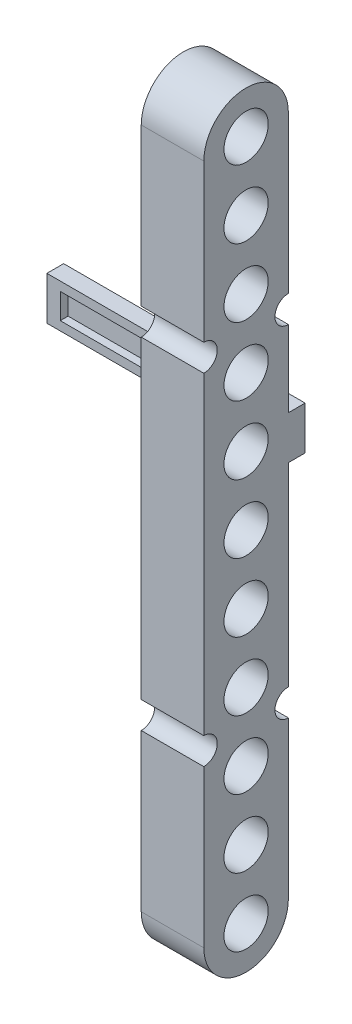
ISO-10303-21;
HEADER;
FILE_DESCRIPTION(('STEP AP214'),'2;1');
FILE_NAME('part.step','',(''),(''),'','','');
FILE_SCHEMA(('AUTOMOTIVE_DESIGN { 1 0 10303 214 1 1 1 1 }'));
ENDSEC;
DATA;
#1=APPLICATION_CONTEXT('core data for automotive mechanical design processes');
#2=APPLICATION_PROTOCOL_DEFINITION('international standard','automotive_design',2000,#1);
#3=PRODUCT_CONTEXT('',#1,'mechanical');
#4=PRODUCT('Part','Part','',(#3));
#5=PRODUCT_RELATED_PRODUCT_CATEGORY('part','',(#4));
#6=PRODUCT_DEFINITION_FORMATION('','',#4);
#7=PRODUCT_DEFINITION_CONTEXT('part definition',#1,'design');
#8=PRODUCT_DEFINITION('design','',#6,#7);
#9=PRODUCT_DEFINITION_SHAPE('','',#8);
#10=(LENGTH_UNIT() NAMED_UNIT(*) SI_UNIT(.MILLI.,.METRE.));
#11=(NAMED_UNIT(*) PLANE_ANGLE_UNIT() SI_UNIT($,.RADIAN.));
#12=(NAMED_UNIT(*) SI_UNIT($,.STERADIAN.) SOLID_ANGLE_UNIT());
#13=UNCERTAINTY_MEASURE_WITH_UNIT(LENGTH_MEASURE(1.E-05),#10,'distance_accuracy_value','');
#14=(GEOMETRIC_REPRESENTATION_CONTEXT(3) GLOBAL_UNCERTAINTY_ASSIGNED_CONTEXT((#13)) GLOBAL_UNIT_ASSIGNED_CONTEXT((#10,
#11,#12)) REPRESENTATION_CONTEXT('',''));
#15=CARTESIAN_POINT('',(0.,0.,0.));
#16=DIRECTION('',(0.,0.,1.));
#17=DIRECTION('',(1.,0.,0.));
#18=AXIS2_PLACEMENT_3D('',#15,#16,#17);
#19=CARTESIAN_POINT('',(0.,0.,-9.45000000000002));
#20=DIRECTION('',(0.,0.,-1.));
#21=DIRECTION('',(0.,1.,0.));
#22=AXIS2_PLACEMENT_3D('',#19,#20,#21);
#23=PLANE('',#22);
#24=DIRECTION('',(0.,1.,0.));
#25=VECTOR('',#24,1.);
#26=CARTESIAN_POINT('',(0.,53.3296441336873,-9.45000000000005));
#27=LINE('',#26,#25);
#28=CARTESIAN_POINT('',(0.,-12.2370411810535,-9.45000000000003));
#29=VERTEX_POINT('',#28);
#30=CARTESIAN_POINT('',(0.,31.1853558663127,-9.45000000000003));
#31=VERTEX_POINT('',#30);
#32=EDGE_CURVE('E395',#29,#31,#27,.T.);
#33=ORIENTED_EDGE('',*,*,#32,.T.);
#34=DIRECTION('',(-1.,0.,0.));
#35=VECTOR('',#34,1.);
#36=CARTESIAN_POINT('',(-38.9999999999999,31.1853558663127,-9.45000000000003));
#37=LINE('',#36,#35);
#38=CARTESIAN_POINT('',(14.,31.1853558663127,-9.45000000000003));
#39=VERTEX_POINT('',#38);
#40=EDGE_CURVE('E203',#39,#31,#37,.T.);
#41=ORIENTED_EDGE('',*,*,#40,.F.);
#42=DIRECTION('',(0.,-1.,0.));
#43=VECTOR('',#42,1.);
#44=CARTESIAN_POINT('',(14.,53.3296441336873,-9.45000000000005));
#45=LINE('',#44,#43);
#46=CARTESIAN_POINT('',(14.,-12.2370411810535,-9.45000000000003));
#47=VERTEX_POINT('',#46);
#48=EDGE_CURVE('E320',#39,#47,#45,.T.);
#49=ORIENTED_EDGE('',*,*,#48,.T.);
#50=DIRECTION('',(-1.,0.,0.));
#51=VECTOR('',#50,1.);
#52=CARTESIAN_POINT('',(186.310080847727,-12.2370411810535,-9.45000000000003));
#53=LINE('',#52,#51);
#54=EDGE_CURVE('E263',#47,#29,#53,.T.);
#55=ORIENTED_EDGE('',*,*,#54,.T.);
#56=EDGE_LOOP('',(#33,#41,#49,#55));
#57=FACE_BOUND('',#56,.T.);
#58=ADVANCED_FACE('F43',(#57),#23,.T.);
#59=CARTESIAN_POINT('',(14.,57.948164724214,-9.45000000000005));
#60=VERTEX_POINT('',#59);
#61=CARTESIAN_POINT('',(14.,40.8553558663126,-9.45000000000004));
#62=VERTEX_POINT('',#61);
#63=EDGE_CURVE('E392',#60,#62,#45,.T.);
#64=ORIENTED_EDGE('',*,*,#63,.T.);
#65=DIRECTION('',(-1.,0.,0.));
#66=VECTOR('',#65,1.);
#67=CARTESIAN_POINT('',(0.,40.8553558663126,-9.45000000000004));
#68=LINE('',#67,#66);
#69=CARTESIAN_POINT('',(0.,40.8553558663126,-9.45000000000004));
#70=VERTEX_POINT('',#69);
#71=EDGE_CURVE('E11',#62,#70,#68,.T.);
#72=ORIENTED_EDGE('',*,*,#71,.T.);
#73=CARTESIAN_POINT('',(0.,57.948164724214,-9.45000000000005));
#74=VERTEX_POINT('',#73);
#75=EDGE_CURVE('E394',#70,#74,#27,.T.);
#76=ORIENTED_EDGE('',*,*,#75,.T.);
#77=DIRECTION('',(-1.,0.,0.));
#78=VECTOR('',#77,1.);
#79=CARTESIAN_POINT('',(186.310080847727,57.948164724214,-9.45000000000005));
#80=LINE('',#79,#78);
#81=EDGE_CURVE('E342',#60,#74,#80,.T.);
#82=ORIENTED_EDGE('',*,*,#81,.F.);
#83=EDGE_LOOP('',(#64,#72,#76,#82));
#84=FACE_BOUND('',#83,.T.);
#85=ADVANCED_FACE('F512',(#84),#23,.T.);
#86=CARTESIAN_POINT('',(14.,53.3296441336873,0.));
#87=DIRECTION('',(-1.,0.,0.));
#88=DIRECTION('',(0.,0.,1.));
#89=AXIS2_PLACEMENT_3D('',#86,#87,#88);
#90=CYLINDRICAL_SURFACE('',#89,4.95000000000002);
#91=CARTESIAN_POINT('',(14.,53.3296441336873,0.));
#92=DIRECTION('',(1.,0.,0.));
#93=DIRECTION('',(0.,0.,-1.));
#94=AXIS2_PLACEMENT_3D('',#91,#92,#93);
#95=CIRCLE('',#94,4.95000000000002);
#96=CARTESIAN_POINT('',(14.,53.3296441336873,-4.95000000000004));
#97=VERTEX_POINT('',#96);
#98=EDGE_CURVE('E413',#97,#97,#95,.T.);
#99=ORIENTED_EDGE('',*,*,#98,.T.);
#100=EDGE_LOOP('',(#99));
#101=FACE_BOUND('',#100,.T.);
#102=CARTESIAN_POINT('',(0.,53.3296441336873,0.));
#103=DIRECTION('',(1.,0.,0.));
#104=DIRECTION('',(0.,0.,-1.));
#105=AXIS2_PLACEMENT_3D('',#102,#103,#104);
#106=CIRCLE('',#105,4.95000000000002);
#107=CARTESIAN_POINT('',(0.,53.3296441336873,-4.95000000000004));
#108=VERTEX_POINT('',#107);
#109=EDGE_CURVE('E404',#108,#108,#106,.T.);
#110=ORIENTED_EDGE('',*,*,#109,.F.);
#111=EDGE_LOOP('',(#110));
#112=FACE_BOUND('',#111,.T.);
#113=ADVANCED_FACE('F530',(#101,#112),#90,.F.);
#114=CARTESIAN_POINT('',(14.,38.0926029526338,0.));
#115=DIRECTION('',(-1.,0.,0.));
#116=DIRECTION('',(0.,0.,1.));
#117=AXIS2_PLACEMENT_3D('',#114,#115,#116);
#118=CYLINDRICAL_SURFACE('',#117,4.95000000000002);
#119=CARTESIAN_POINT('',(14.,38.0926029526338,0.));
#120=DIRECTION('',(1.,0.,0.));
#121=DIRECTION('',(0.,0.,-1.));
#122=AXIS2_PLACEMENT_3D('',#119,#120,#121);
#123=CIRCLE('',#122,4.95000000000002);
#124=CARTESIAN_POINT('',(14.,38.0926029526338,-4.95000000000004));
#125=VERTEX_POINT('',#124);
#126=EDGE_CURVE('E410',#125,#125,#123,.T.);
#127=ORIENTED_EDGE('',*,*,#126,.T.);
#128=EDGE_LOOP('',(#127));
#129=FACE_BOUND('',#128,.T.);
#130=CARTESIAN_POINT('',(0.,38.0926029526338,0.));
#131=DIRECTION('',(1.,0.,0.));
#132=DIRECTION('',(0.,0.,-1.));
#133=AXIS2_PLACEMENT_3D('',#130,#131,#132);
#134=CIRCLE('',#133,4.95000000000002);
#135=CARTESIAN_POINT('',(0.,38.0926029526338,-4.95000000000004));
#136=VERTEX_POINT('',#135);
#137=EDGE_CURVE('E424',#136,#136,#134,.T.);
#138=ORIENTED_EDGE('',*,*,#137,.F.);
#139=EDGE_LOOP('',(#138));
#140=FACE_BOUND('',#139,.T.);
#141=ADVANCED_FACE('F550',(#129,#140),#118,.F.);
#142=CARTESIAN_POINT('',(14.,22.8555617715803,0.));
#143=DIRECTION('',(-1.,0.,0.));
#144=DIRECTION('',(0.,0.,1.));
#145=AXIS2_PLACEMENT_3D('',#142,#143,#144);
#146=CYLINDRICAL_SURFACE('',#145,4.95000000000002);
#147=CARTESIAN_POINT('',(14.,22.8555617715803,0.));
#148=DIRECTION('',(1.,0.,0.));
#149=DIRECTION('',(0.,0.,-1.));
#150=AXIS2_PLACEMENT_3D('',#147,#148,#149);
#151=CIRCLE('',#150,4.95000000000002);
#152=CARTESIAN_POINT('',(14.,22.8555617715803,-4.95000000000003));
#153=VERTEX_POINT('',#152);
#154=EDGE_CURVE('E407',#153,#153,#151,.T.);
#155=ORIENTED_EDGE('',*,*,#154,.T.);
#156=EDGE_LOOP('',(#155));
#157=FACE_BOUND('',#156,.T.);
#158=CARTESIAN_POINT('',(0.,22.8555617715803,0.));
#159=DIRECTION('',(1.,0.,0.));
#160=DIRECTION('',(0.,0.,-1.));
#161=AXIS2_PLACEMENT_3D('',#158,#159,#160);
#162=CIRCLE('',#161,4.95000000000002);
#163=CARTESIAN_POINT('',(0.,22.8555617715803,-4.95000000000003));
#164=VERTEX_POINT('',#163);
#165=EDGE_CURVE('E421',#164,#164,#162,.T.);
#166=ORIENTED_EDGE('',*,*,#165,.F.);
#167=EDGE_LOOP('',(#166));
#168=FACE_BOUND('',#167,.T.);
#169=ADVANCED_FACE('F554',(#157,#168),#146,.F.);
#170=CARTESIAN_POINT('',(14.,-7.61852059052675,0.));
#171=DIRECTION('',(-1.,0.,0.));
#172=DIRECTION('',(0.,0.,1.));
#173=AXIS2_PLACEMENT_3D('',#170,#171,#172);
#174=CYLINDRICAL_SURFACE('',#173,4.95000000000002);
#175=CARTESIAN_POINT('',(14.,-7.61852059052675,0.));
#176=DIRECTION('',(1.,0.,0.));
#177=DIRECTION('',(0.,0.,-1.));
#178=AXIS2_PLACEMENT_3D('',#175,#176,#177);
#179=CIRCLE('',#178,4.95000000000002);
#180=CARTESIAN_POINT('',(14.,-7.61852059052675,-4.95000000000002));
#181=VERTEX_POINT('',#180);
#182=EDGE_CURVE('E403',#181,#181,#179,.T.);
#183=ORIENTED_EDGE('',*,*,#182,.T.);
#184=EDGE_LOOP('',(#183));
#185=FACE_BOUND('',#184,.T.);
#186=CARTESIAN_POINT('',(0.,-7.61852059052675,0.));
#187=DIRECTION('',(1.,0.,0.));
#188=DIRECTION('',(0.,0.,-1.));
#189=AXIS2_PLACEMENT_3D('',#186,#187,#188);
#190=CIRCLE('',#189,4.95000000000002);
#191=CARTESIAN_POINT('',(0.,-7.61852059052675,-4.95000000000002));
#192=VERTEX_POINT('',#191);
#193=EDGE_CURVE('E418',#192,#192,#190,.T.);
#194=ORIENTED_EDGE('',*,*,#193,.F.);
#195=EDGE_LOOP('',(#194));
#196=FACE_BOUND('',#195,.T.);
#197=ADVANCED_FACE('F557',(#185,#196),#174,.F.);
#198=CARTESIAN_POINT('',(14.,7.61852059052675,0.));
#199=DIRECTION('',(-1.,0.,0.));
#200=DIRECTION('',(0.,0.,1.));
#201=AXIS2_PLACEMENT_3D('',#198,#199,#200);
#202=CYLINDRICAL_SURFACE('',#201,4.95000000000002);
#203=CARTESIAN_POINT('',(14.,7.61852059052675,0.));
#204=DIRECTION('',(1.,0.,0.));
#205=DIRECTION('',(0.,0.,-1.));
#206=AXIS2_PLACEMENT_3D('',#203,#204,#205);
#207=CIRCLE('',#206,4.95000000000002);
#208=CARTESIAN_POINT('',(14.,7.61852059052675,-4.95000000000002));
#209=VERTEX_POINT('',#208);
#210=EDGE_CURVE('E400',#209,#209,#207,.T.);
#211=ORIENTED_EDGE('',*,*,#210,.T.);
#212=EDGE_LOOP('',(#211));
#213=FACE_BOUND('',#212,.T.);
#214=CARTESIAN_POINT('',(0.,7.61852059052675,0.));
#215=DIRECTION('',(1.,0.,0.));
#216=DIRECTION('',(0.,0.,-1.));
#217=AXIS2_PLACEMENT_3D('',#214,#215,#216);
#218=CIRCLE('',#217,4.95000000000002);
#219=CARTESIAN_POINT('',(0.,7.61852059052675,-4.95000000000002));
#220=VERTEX_POINT('',#219);
#221=EDGE_CURVE('E398',#220,#220,#218,.T.);
#222=ORIENTED_EDGE('',*,*,#221,.F.);
#223=EDGE_LOOP('',(#222));
#224=FACE_BOUND('',#223,.T.);
#225=ADVANCED_FACE('F45',(#213,#224),#202,.F.);
#226=CARTESIAN_POINT('',(14.,0.,0.));
#227=DIRECTION('',(1.,0.,0.));
#228=DIRECTION('',(0.,0.,-1.));
#229=AXIS2_PLACEMENT_3D('',#226,#227,#228);
#230=PLANE('',#229);
#231=ORIENTED_EDGE('',*,*,#210,.F.);
#232=EDGE_LOOP('',(#231));
#233=FACE_BOUND('',#232,.T.);
#234=ORIENTED_EDGE('',*,*,#182,.F.);
#235=EDGE_LOOP('',(#234));
#236=FACE_BOUND('',#235,.T.);
#237=ORIENTED_EDGE('',*,*,#154,.F.);
#238=EDGE_LOOP('',(#237));
#239=FACE_BOUND('',#238,.T.);
#240=ORIENTED_EDGE('',*,*,#126,.F.);
#241=EDGE_LOOP('',(#240));
#242=FACE_BOUND('',#241,.T.);
#243=ORIENTED_EDGE('',*,*,#98,.F.);
#244=EDGE_LOOP('',(#243));
#245=FACE_BOUND('',#244,.T.);
#246=CARTESIAN_POINT('',(14.,-15.2370411810535,-9.45000000000003));
#247=DIRECTION('',(1.,0.,0.));
#248=DIRECTION('',(0.,0.,-1.));
#249=AXIS2_PLACEMENT_3D('',#246,#247,#248);
#250=CIRCLE('',#249,3.);
#251=CARTESIAN_POINT('',(14.,-18.2370411810535,-9.45000000000003));
#252=VERTEX_POINT('',#251);
#253=EDGE_CURVE('E335',#47,#252,#250,.T.);
#254=ORIENTED_EDGE('',*,*,#253,.F.);
#255=ORIENTED_EDGE('',*,*,#48,.F.);
#256=DIRECTION('',(0.,0.,1.));
#257=VECTOR('',#256,1.);
#258=CARTESIAN_POINT('',(14.,31.1853558663127,-66.0589910588951));
#259=LINE('',#258,#257);
#260=CARTESIAN_POINT('',(14.,31.1853558663127,-13.1999999999994));
#261=VERTEX_POINT('',#260);
#262=EDGE_CURVE('E202',#261,#39,#259,.T.);
#263=ORIENTED_EDGE('',*,*,#262,.F.);
#264=DIRECTION('',(0.,-1.,0.));
#265=VECTOR('',#264,1.);
#266=CARTESIAN_POINT('',(14.,31.1853558663127,-13.1999999999994));
#267=LINE('',#266,#265);
#268=CARTESIAN_POINT('',(14.,40.8553558663126,-13.1999999999995));
#269=VERTEX_POINT('',#268);
#270=EDGE_CURVE('E216',#269,#261,#267,.T.);
#271=ORIENTED_EDGE('',*,*,#270,.F.);
#272=DIRECTION('',(0.,0.,1.));
#273=VECTOR('',#272,1.);
#274=CARTESIAN_POINT('',(14.,40.8553558663126,-66.0589910588951));
#275=LINE('',#274,#273);
#276=EDGE_CURVE('E256',#269,#62,#275,.T.);
#277=ORIENTED_EDGE('',*,*,#276,.T.);
#278=ORIENTED_EDGE('',*,*,#63,.F.);
#279=CARTESIAN_POINT('',(14.,60.948164724214,-9.45000000000005));
#280=DIRECTION('',(1.,0.,0.));
#281=DIRECTION('',(0.,0.,-1.));
#282=AXIS2_PLACEMENT_3D('',#279,#280,#281);
#283=CIRCLE('',#282,3.);
#284=CARTESIAN_POINT('',(14.,63.948164724214,-9.45000000000005));
#285=VERTEX_POINT('',#284);
#286=EDGE_CURVE('E339',#285,#60,#283,.T.);
#287=ORIENTED_EDGE('',*,*,#286,.F.);
#288=DIRECTION('',(0.,-1.,0.));
#289=VECTOR('',#288,1.);
#290=CARTESIAN_POINT('',(14.,63.948164724214,-9.45000000000005));
#291=LINE('',#290,#289);
#292=CARTESIAN_POINT('',(14.,99.0407676768478,-9.45000000000009));
#293=VERTEX_POINT('',#292);
#294=EDGE_CURVE('E343',#293,#285,#291,.T.);
#295=ORIENTED_EDGE('',*,*,#294,.F.);
#296=CARTESIAN_POINT('',(14.,99.0407676768478,0.));
#297=DIRECTION('',(1.,0.,0.));
#298=DIRECTION('',(0.,0.,-1.));
#299=AXIS2_PLACEMENT_3D('',#296,#297,#298);
#300=CIRCLE('',#299,9.45000000000004);
#301=CARTESIAN_POINT('',(14.,99.0407676768478,9.45000000000004));
#302=VERTEX_POINT('',#301);
#303=EDGE_CURVE('E347',#302,#293,#300,.F.);
#304=ORIENTED_EDGE('',*,*,#303,.F.);
#305=DIRECTION('',(0.,1.,0.));
#306=VECTOR('',#305,1.);
#307=CARTESIAN_POINT('',(14.,63.948164724214,9.45000000000004));
#308=LINE('',#307,#306);
#309=CARTESIAN_POINT('',(14.,63.948164724214,9.45000000000004));
#310=VERTEX_POINT('',#309);
#311=EDGE_CURVE('E351',#310,#302,#308,.T.);
#312=ORIENTED_EDGE('',*,*,#311,.F.);
#313=CARTESIAN_POINT('',(14.,60.948164724214,9.44999999999999));
#314=DIRECTION('',(1.,0.,0.));
#315=DIRECTION('',(0.,0.,-1.));
#316=AXIS2_PLACEMENT_3D('',#313,#314,#315);
#317=CIRCLE('',#316,3.);
#318=CARTESIAN_POINT('',(14.,57.948164724214,9.45000000000004));
#319=VERTEX_POINT('',#318);
#320=EDGE_CURVE('E355',#319,#310,#317,.T.);
#321=ORIENTED_EDGE('',*,*,#320,.F.);
#322=DIRECTION('',(0.,1.,0.));
#323=VECTOR('',#322,1.);
#324=CARTESIAN_POINT('',(14.,-12.2370411810535,9.45000000000004));
#325=LINE('',#324,#323);
#326=CARTESIAN_POINT('',(14.,-12.2370411810535,9.45000000000004));
#327=VERTEX_POINT('',#326);
#328=EDGE_CURVE('E359',#327,#319,#325,.T.);
#329=ORIENTED_EDGE('',*,*,#328,.F.);
#330=CARTESIAN_POINT('',(14.,-15.2370411810535,9.45000000000003));
#331=DIRECTION('',(1.,0.,0.));
#332=DIRECTION('',(0.,0.,-1.));
#333=AXIS2_PLACEMENT_3D('',#330,#331,#332);
#334=CIRCLE('',#333,3.);
#335=CARTESIAN_POINT('',(14.,-18.2370411810535,9.45000000000004));
#336=VERTEX_POINT('',#335);
#337=EDGE_CURVE('E363',#336,#327,#334,.T.);
#338=ORIENTED_EDGE('',*,*,#337,.F.);
#339=DIRECTION('',(0.,1.,0.));
#340=VECTOR('',#339,1.);
#341=CARTESIAN_POINT('',(14.,-53.3296441336873,9.45000000000004));
#342=LINE('',#341,#340);
#343=CARTESIAN_POINT('',(14.,-53.3296441336873,9.45000000000005));
#344=VERTEX_POINT('',#343);
#345=EDGE_CURVE('E367',#344,#336,#342,.T.);
#346=ORIENTED_EDGE('',*,*,#345,.F.);
#347=CARTESIAN_POINT('',(14.,-53.3296441336873,0.));
#348=DIRECTION('',(1.,0.,0.));
#349=DIRECTION('',(0.,0.,-1.));
#350=AXIS2_PLACEMENT_3D('',#347,#348,#349);
#351=CIRCLE('',#350,9.45000000000003);
#352=CARTESIAN_POINT('',(14.,-53.3296441336873,-9.45000000000002));
#353=VERTEX_POINT('',#352);
#354=EDGE_CURVE('E371',#353,#344,#351,.F.);
#355=ORIENTED_EDGE('',*,*,#354,.F.);
#356=DIRECTION('',(0.,-1.,0.));
#357=VECTOR('',#356,1.);
#358=CARTESIAN_POINT('',(14.,-18.2370411810535,-9.45000000000003));
#359=LINE('',#358,#357);
#360=EDGE_CURVE('E375',#252,#353,#359,.T.);
#361=ORIENTED_EDGE('',*,*,#360,.F.);
#362=EDGE_LOOP('',(#254,#255,#263,#271,#277,#278,#287,#295,#304,#312,#321,#329,#338,#346,#355,#361));
#363=FACE_BOUND('',#362,.T.);
#364=CARTESIAN_POINT('',(14.,99.0407676768478,0.));
#365=DIRECTION('',(1.,0.,0.));
#366=DIRECTION('',(0.,0.,-1.));
#367=AXIS2_PLACEMENT_3D('',#364,#365,#366);
#368=CIRCLE('',#367,4.95000000000002);
#369=CARTESIAN_POINT('',(14.,99.0407676768478,-4.95000000000007));
#370=VERTEX_POINT('',#369);
#371=EDGE_CURVE('E317',#370,#370,#368,.F.);
#372=ORIENTED_EDGE('',*,*,#371,.T.);
#373=EDGE_LOOP('',(#372));
#374=FACE_BOUND('',#373,.T.);
#375=CARTESIAN_POINT('',(14.,68.5666853147407,0.));
#376=DIRECTION('',(1.,0.,0.));
#377=DIRECTION('',(0.,0.,-1.));
#378=AXIS2_PLACEMENT_3D('',#375,#376,#377);
#379=CIRCLE('',#378,4.95000000000002);
#380=CARTESIAN_POINT('',(14.,68.5666853147407,-4.95000000000005));
#381=VERTEX_POINT('',#380);
#382=EDGE_CURVE('E321',#381,#381,#379,.F.);
#383=ORIENTED_EDGE('',*,*,#382,.T.);
#384=EDGE_LOOP('',(#383));
#385=FACE_BOUND('',#384,.T.);
#386=CARTESIAN_POINT('',(14.,-53.3296441336873,0.));
#387=DIRECTION('',(1.,0.,0.));
#388=DIRECTION('',(0.,0.,-1.));
#389=AXIS2_PLACEMENT_3D('',#386,#387,#388);
#390=CIRCLE('',#389,4.95000000000002);
#391=CARTESIAN_POINT('',(14.,-53.3296441336873,-4.95000000000001));
#392=VERTEX_POINT('',#391);
#393=EDGE_CURVE('E324',#392,#392,#390,.F.);
#394=ORIENTED_EDGE('',*,*,#393,.T.);
#395=EDGE_LOOP('',(#394));
#396=FACE_BOUND('',#395,.T.);
#397=CARTESIAN_POINT('',(14.,-22.8555617715803,0.));
#398=DIRECTION('',(1.,0.,0.));
#399=DIRECTION('',(0.,0.,-1.));
#400=AXIS2_PLACEMENT_3D('',#397,#398,#399);
#401=CIRCLE('',#400,4.95000000000002);
#402=CARTESIAN_POINT('',(14.,-22.8555617715803,-4.95000000000002));
#403=VERTEX_POINT('',#402);
#404=EDGE_CURVE('E327',#403,#403,#401,.F.);
#405=ORIENTED_EDGE('',*,*,#404,.T.);
#406=EDGE_LOOP('',(#405));
#407=FACE_BOUND('',#406,.T.);
#408=CARTESIAN_POINT('',(14.,-38.0926029526338,0.));
#409=DIRECTION('',(1.,0.,0.));
#410=DIRECTION('',(0.,0.,-1.));
#411=AXIS2_PLACEMENT_3D('',#408,#409,#410);
#412=CIRCLE('',#411,4.95000000000002);
#413=CARTESIAN_POINT('',(14.,-38.0926029526338,-4.95000000000001));
#414=VERTEX_POINT('',#413);
#415=EDGE_CURVE('E330',#414,#414,#412,.F.);
#416=ORIENTED_EDGE('',*,*,#415,.T.);
#417=EDGE_LOOP('',(#416));
#418=FACE_BOUND('',#417,.T.);
#419=CARTESIAN_POINT('',(14.,83.8037264957942,0.));
#420=DIRECTION('',(1.,0.,0.));
#421=DIRECTION('',(0.,0.,-1.));
#422=AXIS2_PLACEMENT_3D('',#419,#420,#421);
#423=CIRCLE('',#422,4.95000000000002);
#424=CARTESIAN_POINT('',(14.,83.8037264957942,-4.95000000000006));
#425=VERTEX_POINT('',#424);
#426=EDGE_CURVE('E267',#425,#425,#423,.F.);
#427=ORIENTED_EDGE('',*,*,#426,.T.);
#428=EDGE_LOOP('',(#427));
#429=FACE_BOUND('',#428,.T.);
#430=ADVANCED_FACE('F464',(#233,#236,#239,#242,#245,#363,#374,#385,#396,#407,#418,#429),#230,.T.);
#431=CARTESIAN_POINT('',(0.,0.,0.));
#432=DIRECTION('',(1.,0.,0.));
#433=DIRECTION('',(0.,0.,-1.));
#434=AXIS2_PLACEMENT_3D('',#431,#432,#433);
#435=PLANE('',#434);
#436=ORIENTED_EDGE('',*,*,#221,.T.);
#437=EDGE_LOOP('',(#436));
#438=FACE_BOUND('',#437,.T.);
#439=ORIENTED_EDGE('',*,*,#193,.T.);
#440=EDGE_LOOP('',(#439));
#441=FACE_BOUND('',#440,.T.);
#442=ORIENTED_EDGE('',*,*,#165,.T.);
#443=EDGE_LOOP('',(#442));
#444=FACE_BOUND('',#443,.T.);
#445=ORIENTED_EDGE('',*,*,#137,.T.);
#446=EDGE_LOOP('',(#445));
#447=FACE_BOUND('',#446,.T.);
#448=ORIENTED_EDGE('',*,*,#109,.T.);
#449=EDGE_LOOP('',(#448));
#450=FACE_BOUND('',#449,.T.);
#451=ORIENTED_EDGE('',*,*,#32,.F.);
#452=CARTESIAN_POINT('',(0.,-15.2370411810535,-9.45000000000003));
#453=DIRECTION('',(1.,0.,0.));
#454=DIRECTION('',(0.,0.,1.));
#455=AXIS2_PLACEMENT_3D('',#452,#453,#454);
#456=CIRCLE('',#455,3.);
#457=CARTESIAN_POINT('',(0.,-18.2370411810535,-9.45000000000003));
#458=VERTEX_POINT('',#457);
#459=EDGE_CURVE('E295',#29,#458,#456,.T.);
#460=ORIENTED_EDGE('',*,*,#459,.T.);
#461=DIRECTION('',(0.,-1.,0.));
#462=VECTOR('',#461,1.);
#463=CARTESIAN_POINT('',(0.,-18.2370411810535,-9.45000000000003));
#464=LINE('',#463,#462);
#465=CARTESIAN_POINT('',(0.,-53.3296441336873,-9.45000000000002));
#466=VERTEX_POINT('',#465);
#467=EDGE_CURVE('E292',#458,#466,#464,.T.);
#468=ORIENTED_EDGE('',*,*,#467,.T.);
#469=CARTESIAN_POINT('',(0.,-53.3296441336873,0.));
#470=DIRECTION('',(-1.,0.,0.));
#471=DIRECTION('',(0.,0.,1.));
#472=AXIS2_PLACEMENT_3D('',#469,#470,#471);
#473=CIRCLE('',#472,9.45000000000003);
#474=CARTESIAN_POINT('',(0.,-53.3296441336873,9.45000000000004));
#475=VERTEX_POINT('',#474);
#476=EDGE_CURVE('E289',#466,#475,#473,.T.);
#477=ORIENTED_EDGE('',*,*,#476,.T.);
#478=DIRECTION('',(0.,1.,0.));
#479=VECTOR('',#478,1.);
#480=CARTESIAN_POINT('',(0.,-53.3296441336873,9.45000000000004));
#481=LINE('',#480,#479);
#482=CARTESIAN_POINT('',(0.,-18.2370411810535,9.45000000000004));
#483=VERTEX_POINT('',#482);
#484=EDGE_CURVE('E286',#475,#483,#481,.T.);
#485=ORIENTED_EDGE('',*,*,#484,.T.);
#486=CARTESIAN_POINT('',(0.,-15.2370411810535,9.45000000000003));
#487=DIRECTION('',(1.,0.,0.));
#488=DIRECTION('',(0.,0.,1.));
#489=AXIS2_PLACEMENT_3D('',#486,#487,#488);
#490=CIRCLE('',#489,3.);
#491=CARTESIAN_POINT('',(0.,-12.2370411810535,9.45000000000004));
#492=VERTEX_POINT('',#491);
#493=EDGE_CURVE('E283',#483,#492,#490,.T.);
#494=ORIENTED_EDGE('',*,*,#493,.T.);
#495=DIRECTION('',(0.,1.,0.));
#496=VECTOR('',#495,1.);
#497=CARTESIAN_POINT('',(0.,-12.2370411810535,9.45000000000004));
#498=LINE('',#497,#496);
#499=CARTESIAN_POINT('',(0.,57.948164724214,9.45000000000004));
#500=VERTEX_POINT('',#499);
#501=EDGE_CURVE('E280',#492,#500,#498,.T.);
#502=ORIENTED_EDGE('',*,*,#501,.T.);
#503=CARTESIAN_POINT('',(0.,60.948164724214,9.44999999999999));
#504=DIRECTION('',(1.,0.,0.));
#505=DIRECTION('',(0.,0.,1.));
#506=AXIS2_PLACEMENT_3D('',#503,#504,#505);
#507=CIRCLE('',#506,3.);
#508=CARTESIAN_POINT('',(0.,63.948164724214,9.45000000000004));
#509=VERTEX_POINT('',#508);
#510=EDGE_CURVE('E277',#500,#509,#507,.T.);
#511=ORIENTED_EDGE('',*,*,#510,.T.);
#512=DIRECTION('',(0.,1.,0.));
#513=VECTOR('',#512,1.);
#514=CARTESIAN_POINT('',(0.,63.948164724214,9.45000000000004));
#515=LINE('',#514,#513);
#516=CARTESIAN_POINT('',(0.,99.0407676768478,9.45));
#517=VERTEX_POINT('',#516);
#518=EDGE_CURVE('E274',#509,#517,#515,.T.);
#519=ORIENTED_EDGE('',*,*,#518,.T.);
#520=CARTESIAN_POINT('',(0.,99.0407676768478,0.));
#521=DIRECTION('',(-1.,0.,0.));
#522=DIRECTION('',(0.,0.,1.));
#523=AXIS2_PLACEMENT_3D('',#520,#521,#522);
#524=CIRCLE('',#523,9.45000000000004);
#525=CARTESIAN_POINT('',(0.,99.0407676768478,-9.45000000000005));
#526=VERTEX_POINT('',#525);
#527=EDGE_CURVE('E271',#517,#526,#524,.T.);
#528=ORIENTED_EDGE('',*,*,#527,.T.);
#529=DIRECTION('',(0.,-1.,0.));
#530=VECTOR('',#529,1.);
#531=CARTESIAN_POINT('',(0.,63.948164724214,-9.45000000000005));
#532=LINE('',#531,#530);
#533=CARTESIAN_POINT('',(0.,63.948164724214,-9.45000000000005));
#534=VERTEX_POINT('',#533);
#535=EDGE_CURVE('E268',#526,#534,#532,.T.);
#536=ORIENTED_EDGE('',*,*,#535,.T.);
#537=CARTESIAN_POINT('',(0.,60.948164724214,-9.45000000000005));
#538=DIRECTION('',(1.,0.,0.));
#539=DIRECTION('',(0.,0.,1.));
#540=AXIS2_PLACEMENT_3D('',#537,#538,#539);
#541=CIRCLE('',#540,3.);
#542=EDGE_CURVE('E264',#534,#74,#541,.T.);
#543=ORIENTED_EDGE('',*,*,#542,.T.);
#544=ORIENTED_EDGE('',*,*,#75,.F.);
#545=CARTESIAN_POINT('',(0.,38.8553558663126,-9.45000000000004));
#546=VERTEX_POINT('',#545);
#547=EDGE_CURVE('E438',#546,#70,#27,.T.);
#548=ORIENTED_EDGE('',*,*,#547,.F.);
#549=CARTESIAN_POINT('',(0.,33.1853558663127,-9.45000000000004));
#550=VERTEX_POINT('',#549);
#551=EDGE_CURVE('E455',#550,#546,#27,.T.);
#552=ORIENTED_EDGE('',*,*,#551,.F.);
#553=EDGE_CURVE('E399',#31,#550,#27,.T.);
#554=ORIENTED_EDGE('',*,*,#553,.F.);
#555=EDGE_LOOP('',(#451,#460,#468,#477,#485,#494,#502,#511,#519,#528,#536,#543,#544,#548,#552,#554));
#556=FACE_BOUND('',#555,.T.);
#557=CARTESIAN_POINT('',(0.,99.0407676768478,0.));
#558=DIRECTION('',(-1.,0.,0.));
#559=DIRECTION('',(0.,0.,1.));
#560=AXIS2_PLACEMENT_3D('',#557,#558,#559);
#561=CIRCLE('',#560,4.95000000000002);
#562=CARTESIAN_POINT('',(0.,99.0407676768478,4.94999999999998));
#563=VERTEX_POINT('',#562);
#564=EDGE_CURVE('E299',#563,#563,#561,.T.);
#565=ORIENTED_EDGE('',*,*,#564,.F.);
#566=EDGE_LOOP('',(#565));
#567=FACE_BOUND('',#566,.T.);
#568=CARTESIAN_POINT('',(0.,83.8037264957942,0.));
#569=DIRECTION('',(-1.,0.,0.));
#570=DIRECTION('',(0.,0.,1.));
#571=AXIS2_PLACEMENT_3D('',#568,#569,#570);
#572=CIRCLE('',#571,4.95000000000002);
#573=CARTESIAN_POINT('',(0.,83.8037264957942,4.94999999999999));
#574=VERTEX_POINT('',#573);
#575=EDGE_CURVE('E302',#574,#574,#572,.T.);
#576=ORIENTED_EDGE('',*,*,#575,.F.);
#577=EDGE_LOOP('',(#576));
#578=FACE_BOUND('',#577,.T.);
#579=CARTESIAN_POINT('',(0.,68.5666853147407,0.));
#580=DIRECTION('',(-1.,0.,0.));
#581=DIRECTION('',(0.,0.,1.));
#582=AXIS2_PLACEMENT_3D('',#579,#580,#581);
#583=CIRCLE('',#582,4.95000000000002);
#584=CARTESIAN_POINT('',(0.,68.5666853147407,4.94999999999999));
#585=VERTEX_POINT('',#584);
#586=EDGE_CURVE('E306',#585,#585,#583,.T.);
#587=ORIENTED_EDGE('',*,*,#586,.F.);
#588=EDGE_LOOP('',(#587));
#589=FACE_BOUND('',#588,.T.);
#590=CARTESIAN_POINT('',(0.,-53.3296441336873,0.));
#591=DIRECTION('',(-1.,0.,0.));
#592=DIRECTION('',(0.,0.,1.));
#593=AXIS2_PLACEMENT_3D('',#590,#591,#592);
#594=CIRCLE('',#593,4.95000000000002);
#595=CARTESIAN_POINT('',(0.,-53.3296441336873,4.95000000000004));
#596=VERTEX_POINT('',#595);
#597=EDGE_CURVE('E309',#596,#596,#594,.T.);
#598=ORIENTED_EDGE('',*,*,#597,.F.);
#599=EDGE_LOOP('',(#598));
#600=FACE_BOUND('',#599,.T.);
#601=CARTESIAN_POINT('',(0.,-38.0926029526338,0.));
#602=DIRECTION('',(-1.,0.,0.));
#603=DIRECTION('',(0.,0.,1.));
#604=AXIS2_PLACEMENT_3D('',#601,#602,#603);
#605=CIRCLE('',#604,4.95000000000002);
#606=CARTESIAN_POINT('',(0.,-38.0926029526338,4.95000000000003));
#607=VERTEX_POINT('',#606);
#608=EDGE_CURVE('E312',#607,#607,#605,.T.);
#609=ORIENTED_EDGE('',*,*,#608,.F.);
#610=EDGE_LOOP('',(#609));
#611=FACE_BOUND('',#610,.T.);
#612=CARTESIAN_POINT('',(0.,-22.8555617715803,0.));
#613=DIRECTION('',(-1.,0.,0.));
#614=DIRECTION('',(0.,0.,1.));
#615=AXIS2_PLACEMENT_3D('',#612,#613,#614);
#616=CIRCLE('',#615,4.95000000000002);
#617=CARTESIAN_POINT('',(0.,-22.8555617715803,4.95000000000002));
#618=VERTEX_POINT('',#617);
#619=EDGE_CURVE('E298',#618,#618,#616,.T.);
#620=ORIENTED_EDGE('',*,*,#619,.F.);
#621=EDGE_LOOP('',(#620));
#622=FACE_BOUND('',#621,.T.);
#623=ADVANCED_FACE('F457',(#438,#441,#444,#447,#450,#556,#567,#578,#589,#600,#611,#622),#435,.F.);
#624=DIRECTION('',(-1.,0.,0.));
#625=VECTOR('',#624,1.);
#626=CARTESIAN_POINT('',(-36.9999999999999,33.1853558663127,-9.45000000000004));
#627=LINE('',#626,#625);
#628=CARTESIAN_POINT('',(12.,33.1853558663127,-9.45000000000004));
#629=VERTEX_POINT('',#628);
#630=EDGE_CURVE('E238',#629,#550,#627,.T.);
#631=ORIENTED_EDGE('',*,*,#630,.T.);
#632=ORIENTED_EDGE('',*,*,#551,.T.);
#633=DIRECTION('',(-1.,0.,0.));
#634=VECTOR('',#633,1.);
#635=CARTESIAN_POINT('',(0.,38.8553558663126,-9.45000000000004));
#636=LINE('',#635,#634);
#637=CARTESIAN_POINT('',(12.,38.8553558663126,-9.45000000000004));
#638=VERTEX_POINT('',#637);
#639=EDGE_CURVE('E51',#638,#546,#636,.T.);
#640=ORIENTED_EDGE('',*,*,#639,.F.);
#641=DIRECTION('',(0.,-1.,0.));
#642=VECTOR('',#641,1.);
#643=CARTESIAN_POINT('',(12.,33.1853558663127,-9.45000000000004));
#644=LINE('',#643,#642);
#645=EDGE_CURVE('E58',#638,#629,#644,.T.);
#646=ORIENTED_EDGE('',*,*,#645,.T.);
#647=EDGE_LOOP('',(#631,#632,#640,#646));
#648=FACE_BOUND('',#647,.T.);
#649=ADVANCED_FACE('F454',(#648),#23,.T.);
#650=CARTESIAN_POINT('',(186.310080847727,60.948164724214,-9.45000000000005));
#651=DIRECTION('',(-1.,0.,0.));
#652=DIRECTION('',(0.,0.,1.));
#653=AXIS2_PLACEMENT_3D('',#650,#651,#652);
#654=CYLINDRICAL_SURFACE('',#653,3.);
#655=DIRECTION('',(-1.,0.,0.));
#656=VECTOR('',#655,1.);
#657=CARTESIAN_POINT('',(186.310080847727,63.948164724214,-9.45000000000005));
#658=LINE('',#657,#656);
#659=EDGE_CURVE('E346',#285,#534,#658,.T.);
#660=ORIENTED_EDGE('',*,*,#659,.F.);
#661=ORIENTED_EDGE('',*,*,#286,.T.);
#662=ORIENTED_EDGE('',*,*,#81,.T.);
#663=ORIENTED_EDGE('',*,*,#542,.F.);
#664=EDGE_LOOP('',(#660,#661,#662,#663));
#665=FACE_BOUND('',#664,.T.);
#666=ADVANCED_FACE('F509',(#665),#654,.F.);
#667=CARTESIAN_POINT('',(186.310080847727,63.948164724214,-9.45000000000005));
#668=DIRECTION('',(0.,0.,-1.));
#669=DIRECTION('',(-1.,0.,0.));
#670=AXIS2_PLACEMENT_3D('',#667,#668,#669);
#671=PLANE('',#670);
#672=DIRECTION('',(-1.,0.,0.));
#673=VECTOR('',#672,1.);
#674=CARTESIAN_POINT('',(186.310080847727,99.0407676768478,-9.45000000000005));
#675=LINE('',#674,#673);
#676=EDGE_CURVE('E350',#293,#526,#675,.T.);
#677=ORIENTED_EDGE('',*,*,#676,.F.);
#678=ORIENTED_EDGE('',*,*,#294,.T.);
#679=ORIENTED_EDGE('',*,*,#659,.T.);
#680=ORIENTED_EDGE('',*,*,#535,.F.);
#681=EDGE_LOOP('',(#677,#678,#679,#680));
#682=FACE_BOUND('',#681,.T.);
#683=ADVANCED_FACE('F505',(#682),#671,.T.);
#684=CARTESIAN_POINT('',(186.310080847727,99.0407676768478,0.));
#685=DIRECTION('',(-1.,0.,0.));
#686=DIRECTION('',(0.,0.,1.));
#687=AXIS2_PLACEMENT_3D('',#684,#685,#686);
#688=CYLINDRICAL_SURFACE('',#687,9.45000000000004);
#689=DIRECTION('',(-1.,0.,0.));
#690=VECTOR('',#689,1.);
#691=CARTESIAN_POINT('',(186.310080847727,99.0407676768478,9.45));
#692=LINE('',#691,#690);
#693=EDGE_CURVE('E354',#302,#517,#692,.T.);
#694=ORIENTED_EDGE('',*,*,#693,.F.);
#695=ORIENTED_EDGE('',*,*,#303,.T.);
#696=ORIENTED_EDGE('',*,*,#676,.T.);
#697=ORIENTED_EDGE('',*,*,#527,.F.);
#698=EDGE_LOOP('',(#694,#695,#696,#697));
#699=FACE_BOUND('',#698,.T.);
#700=ADVANCED_FACE('F501',(#699),#688,.T.);
#701=CARTESIAN_POINT('',(186.310080847727,63.948164724214,9.45000000000004));
#702=DIRECTION('',(0.,0.,1.));
#703=DIRECTION('',(0.,-1.,0.));
#704=AXIS2_PLACEMENT_3D('',#701,#702,#703);
#705=PLANE('',#704);
#706=DIRECTION('',(-1.,0.,0.));
#707=VECTOR('',#706,1.);
#708=CARTESIAN_POINT('',(186.310080847727,63.948164724214,9.45000000000004));
#709=LINE('',#708,#707);
#710=EDGE_CURVE('E358',#310,#509,#709,.T.);
#711=ORIENTED_EDGE('',*,*,#710,.F.);
#712=ORIENTED_EDGE('',*,*,#311,.T.);
#713=ORIENTED_EDGE('',*,*,#693,.T.);
#714=ORIENTED_EDGE('',*,*,#518,.F.);
#715=EDGE_LOOP('',(#711,#712,#713,#714));
#716=FACE_BOUND('',#715,.T.);
#717=ADVANCED_FACE('F498',(#716),#705,.T.);
#718=CARTESIAN_POINT('',(186.310080847727,60.948164724214,9.44999999999999));
#719=DIRECTION('',(-1.,0.,0.));
#720=DIRECTION('',(0.,0.,1.));
#721=AXIS2_PLACEMENT_3D('',#718,#719,#720);
#722=CYLINDRICAL_SURFACE('',#721,3.);
#723=DIRECTION('',(-1.,0.,0.));
#724=VECTOR('',#723,1.);
#725=CARTESIAN_POINT('',(186.310080847727,57.948164724214,9.45000000000004));
#726=LINE('',#725,#724);
#727=EDGE_CURVE('E362',#319,#500,#726,.T.);
#728=ORIENTED_EDGE('',*,*,#727,.F.);
#729=ORIENTED_EDGE('',*,*,#320,.T.);
#730=ORIENTED_EDGE('',*,*,#710,.T.);
#731=ORIENTED_EDGE('',*,*,#510,.F.);
#732=EDGE_LOOP('',(#728,#729,#730,#731));
#733=FACE_BOUND('',#732,.T.);
#734=ADVANCED_FACE('F493',(#733),#722,.F.);
#735=CARTESIAN_POINT('',(186.310080847727,-12.2370411810535,9.45000000000004));
#736=DIRECTION('',(0.,0.,1.));
#737=DIRECTION('',(0.,-1.,0.));
#738=AXIS2_PLACEMENT_3D('',#735,#736,#737);
#739=PLANE('',#738);
#740=DIRECTION('',(-1.,0.,0.));
#741=VECTOR('',#740,1.);
#742=CARTESIAN_POINT('',(186.310080847727,-12.2370411810535,9.45000000000004));
#743=LINE('',#742,#741);
#744=EDGE_CURVE('E366',#327,#492,#743,.T.);
#745=ORIENTED_EDGE('',*,*,#744,.F.);
#746=ORIENTED_EDGE('',*,*,#328,.T.);
#747=ORIENTED_EDGE('',*,*,#727,.T.);
#748=ORIENTED_EDGE('',*,*,#501,.F.);
#749=EDGE_LOOP('',(#745,#746,#747,#748));
#750=FACE_BOUND('',#749,.T.);
#751=ADVANCED_FACE('F489',(#750),#739,.T.);
#752=CARTESIAN_POINT('',(186.310080847727,-15.2370411810535,9.45000000000003));
#753=DIRECTION('',(-1.,0.,0.));
#754=DIRECTION('',(0.,0.,1.));
#755=AXIS2_PLACEMENT_3D('',#752,#753,#754);
#756=CYLINDRICAL_SURFACE('',#755,3.);
#757=DIRECTION('',(-1.,0.,0.));
#758=VECTOR('',#757,1.);
#759=CARTESIAN_POINT('',(186.310080847727,-18.2370411810535,9.45000000000004));
#760=LINE('',#759,#758);
#761=EDGE_CURVE('E370',#336,#483,#760,.T.);
#762=ORIENTED_EDGE('',*,*,#761,.F.);
#763=ORIENTED_EDGE('',*,*,#337,.T.);
#764=ORIENTED_EDGE('',*,*,#744,.T.);
#765=ORIENTED_EDGE('',*,*,#493,.F.);
#766=EDGE_LOOP('',(#762,#763,#764,#765));
#767=FACE_BOUND('',#766,.T.);
#768=ADVANCED_FACE('F486',(#767),#756,.F.);
#769=CARTESIAN_POINT('',(186.310080847727,-53.3296441336873,9.45000000000004));
#770=DIRECTION('',(0.,0.,1.));
#771=DIRECTION('',(1.,0.,0.));
#772=AXIS2_PLACEMENT_3D('',#769,#770,#771);
#773=PLANE('',#772);
#774=DIRECTION('',(-1.,0.,0.));
#775=VECTOR('',#774,1.);
#776=CARTESIAN_POINT('',(186.310080847727,-53.3296441336873,9.45000000000004));
#777=LINE('',#776,#775);
#778=EDGE_CURVE('E374',#344,#475,#777,.T.);
#779=ORIENTED_EDGE('',*,*,#778,.F.);
#780=ORIENTED_EDGE('',*,*,#345,.T.);
#781=ORIENTED_EDGE('',*,*,#761,.T.);
#782=ORIENTED_EDGE('',*,*,#484,.F.);
#783=EDGE_LOOP('',(#779,#780,#781,#782));
#784=FACE_BOUND('',#783,.T.);
#785=ADVANCED_FACE('F481',(#784),#773,.T.);
#786=CARTESIAN_POINT('',(186.310080847727,-53.3296441336873,0.));
#787=DIRECTION('',(-1.,0.,0.));
#788=DIRECTION('',(0.,0.,1.));
#789=AXIS2_PLACEMENT_3D('',#786,#787,#788);
#790=CYLINDRICAL_SURFACE('',#789,9.45000000000003);
#791=DIRECTION('',(-1.,0.,0.));
#792=VECTOR('',#791,1.);
#793=CARTESIAN_POINT('',(186.310080847727,-53.3296441336873,-9.45000000000002));
#794=LINE('',#793,#792);
#795=EDGE_CURVE('E338',#353,#466,#794,.T.);
#796=ORIENTED_EDGE('',*,*,#795,.F.);
#797=ORIENTED_EDGE('',*,*,#354,.T.);
#798=ORIENTED_EDGE('',*,*,#778,.T.);
#799=ORIENTED_EDGE('',*,*,#476,.F.);
#800=EDGE_LOOP('',(#796,#797,#798,#799));
#801=FACE_BOUND('',#800,.T.);
#802=ADVANCED_FACE('F477',(#801),#790,.T.);
#803=CARTESIAN_POINT('',(186.310080847727,-18.2370411810535,-9.45000000000003));
#804=DIRECTION('',(0.,0.,-1.));
#805=DIRECTION('',(0.,1.,0.));
#806=AXIS2_PLACEMENT_3D('',#803,#804,#805);
#807=PLANE('',#806);
#808=DIRECTION('',(-1.,0.,0.));
#809=VECTOR('',#808,1.);
#810=CARTESIAN_POINT('',(186.310080847727,-18.2370411810535,-9.45000000000003));
#811=LINE('',#810,#809);
#812=EDGE_CURVE('E303',#252,#458,#811,.T.);
#813=ORIENTED_EDGE('',*,*,#812,.F.);
#814=ORIENTED_EDGE('',*,*,#360,.T.);
#815=ORIENTED_EDGE('',*,*,#795,.T.);
#816=ORIENTED_EDGE('',*,*,#467,.F.);
#817=EDGE_LOOP('',(#813,#814,#815,#816));
#818=FACE_BOUND('',#817,.T.);
#819=ADVANCED_FACE('F474',(#818),#807,.T.);
#820=CARTESIAN_POINT('',(186.310080847727,-15.2370411810535,-9.45000000000003));
#821=DIRECTION('',(-1.,0.,0.));
#822=DIRECTION('',(0.,0.,1.));
#823=AXIS2_PLACEMENT_3D('',#820,#821,#822);
#824=CYLINDRICAL_SURFACE('',#823,3.);
#825=ORIENTED_EDGE('',*,*,#54,.F.);
#826=ORIENTED_EDGE('',*,*,#253,.T.);
#827=ORIENTED_EDGE('',*,*,#812,.T.);
#828=ORIENTED_EDGE('',*,*,#459,.F.);
#829=EDGE_LOOP('',(#825,#826,#827,#828));
#830=FACE_BOUND('',#829,.T.);
#831=ADVANCED_FACE('F470',(#830),#824,.F.);
#832=CARTESIAN_POINT('',(186.310080847727,99.0407676768478,0.));
#833=DIRECTION('',(-1.,0.,0.));
#834=DIRECTION('',(0.,0.,1.));
#835=AXIS2_PLACEMENT_3D('',#832,#833,#834);
#836=CYLINDRICAL_SURFACE('',#835,4.95000000000002);
#837=ORIENTED_EDGE('',*,*,#564,.T.);
#838=EDGE_LOOP('',(#837));
#839=FACE_BOUND('',#838,.T.);
#840=ORIENTED_EDGE('',*,*,#371,.F.);
#841=EDGE_LOOP('',(#840));
#842=FACE_BOUND('',#841,.T.);
#843=ADVANCED_FACE('F665',(#839,#842),#836,.F.);
#844=CARTESIAN_POINT('',(186.310080847727,83.8037264957942,0.));
#845=DIRECTION('',(-1.,0.,0.));
#846=DIRECTION('',(0.,0.,1.));
#847=AXIS2_PLACEMENT_3D('',#844,#845,#846);
#848=CYLINDRICAL_SURFACE('',#847,4.95000000000002);
#849=ORIENTED_EDGE('',*,*,#575,.T.);
#850=EDGE_LOOP('',(#849));
#851=FACE_BOUND('',#850,.T.);
#852=ORIENTED_EDGE('',*,*,#426,.F.);
#853=EDGE_LOOP('',(#852));
#854=FACE_BOUND('',#853,.T.);
#855=ADVANCED_FACE('F673',(#851,#854),#848,.F.);
#856=CARTESIAN_POINT('',(186.310080847727,68.5666853147407,0.));
#857=DIRECTION('',(-1.,0.,0.));
#858=DIRECTION('',(0.,0.,1.));
#859=AXIS2_PLACEMENT_3D('',#856,#857,#858);
#860=CYLINDRICAL_SURFACE('',#859,4.95000000000002);
#861=ORIENTED_EDGE('',*,*,#586,.T.);
#862=EDGE_LOOP('',(#861));
#863=FACE_BOUND('',#862,.T.);
#864=ORIENTED_EDGE('',*,*,#382,.F.);
#865=EDGE_LOOP('',(#864));
#866=FACE_BOUND('',#865,.T.);
#867=ADVANCED_FACE('F682',(#863,#866),#860,.F.);
#868=CARTESIAN_POINT('',(186.310080847727,-53.3296441336873,0.));
#869=DIRECTION('',(-1.,0.,0.));
#870=DIRECTION('',(0.,0.,1.));
#871=AXIS2_PLACEMENT_3D('',#868,#869,#870);
#872=CYLINDRICAL_SURFACE('',#871,4.95000000000002);
#873=ORIENTED_EDGE('',*,*,#597,.T.);
#874=EDGE_LOOP('',(#873));
#875=FACE_BOUND('',#874,.T.);
#876=ORIENTED_EDGE('',*,*,#393,.F.);
#877=EDGE_LOOP('',(#876));
#878=FACE_BOUND('',#877,.T.);
#879=ADVANCED_FACE('F691',(#875,#878),#872,.F.);
#880=CARTESIAN_POINT('',(186.310080847727,-38.0926029526338,0.));
#881=DIRECTION('',(-1.,0.,0.));
#882=DIRECTION('',(0.,0.,1.));
#883=AXIS2_PLACEMENT_3D('',#880,#881,#882);
#884=CYLINDRICAL_SURFACE('',#883,4.95000000000002);
#885=ORIENTED_EDGE('',*,*,#608,.T.);
#886=EDGE_LOOP('',(#885));
#887=FACE_BOUND('',#886,.T.);
#888=ORIENTED_EDGE('',*,*,#415,.F.);
#889=EDGE_LOOP('',(#888));
#890=FACE_BOUND('',#889,.T.);
#891=ADVANCED_FACE('F700',(#887,#890),#884,.F.);
#892=CARTESIAN_POINT('',(186.310080847727,-22.8555617715803,0.));
#893=DIRECTION('',(-1.,0.,0.));
#894=DIRECTION('',(0.,0.,1.));
#895=AXIS2_PLACEMENT_3D('',#892,#893,#894);
#896=CYLINDRICAL_SURFACE('',#895,4.95000000000002);
#897=ORIENTED_EDGE('',*,*,#619,.T.);
#898=EDGE_LOOP('',(#897));
#899=FACE_BOUND('',#898,.T.);
#900=ORIENTED_EDGE('',*,*,#404,.F.);
#901=EDGE_LOOP('',(#900));
#902=FACE_BOUND('',#901,.T.);
#903=ADVANCED_FACE('F708',(#899,#902),#896,.F.);
#904=CARTESIAN_POINT('',(0.,0.,-9.45000000000002));
#905=DIRECTION('',(0.,0.,1.));
#906=DIRECTION('',(0.,-1.,0.));
#907=AXIS2_PLACEMENT_3D('',#904,#905,#906);
#908=PLANE('',#907);
#909=ORIENTED_EDGE('',*,*,#547,.T.);
#910=DIRECTION('',(1.,0.,0.));
#911=VECTOR('',#910,1.);
#912=CARTESIAN_POINT('',(-38.9999999999999,40.8553558663126,-9.45000000000004));
#913=LINE('',#912,#911);
#914=CARTESIAN_POINT('',(-39.9999999999999,40.8553558663127,-9.45000000000004));
#915=VERTEX_POINT('',#914);
#916=EDGE_CURVE('E251',#915,#70,#913,.T.);
#917=ORIENTED_EDGE('',*,*,#916,.F.);
#918=DIRECTION('',(0.,1.,0.));
#919=VECTOR('',#918,1.);
#920=CARTESIAN_POINT('',(-39.9999999999999,31.1853558663127,-9.45000000000003));
#921=LINE('',#920,#919);
#922=CARTESIAN_POINT('',(-39.9999999999999,31.1853558663127,-9.45000000000003));
#923=VERTEX_POINT('',#922);
#924=EDGE_CURVE('E249',#923,#915,#921,.T.);
#925=ORIENTED_EDGE('',*,*,#924,.F.);
#926=EDGE_CURVE('E198',#31,#923,#37,.T.);
#927=ORIENTED_EDGE('',*,*,#926,.F.);
#928=ORIENTED_EDGE('',*,*,#553,.T.);
#929=CARTESIAN_POINT('',(-36.9999999999999,33.1853558663127,-9.45000000000003));
#930=VERTEX_POINT('',#929);
#931=EDGE_CURVE('E237',#550,#930,#627,.T.);
#932=ORIENTED_EDGE('',*,*,#931,.T.);
#933=DIRECTION('',(0.,1.,0.));
#934=VECTOR('',#933,1.);
#935=CARTESIAN_POINT('',(-36.9999999999999,33.1853558663127,-9.45000000000004));
#936=LINE('',#935,#934);
#937=CARTESIAN_POINT('',(-36.9999999999999,38.8553558663126,-9.45000000000004));
#938=VERTEX_POINT('',#937);
#939=EDGE_CURVE('E230',#930,#938,#936,.T.);
#940=ORIENTED_EDGE('',*,*,#939,.T.);
#941=DIRECTION('',(1.,0.,0.));
#942=VECTOR('',#941,1.);
#943=CARTESIAN_POINT('',(-36.9999999999999,38.8553558663126,-9.45000000000004));
#944=LINE('',#943,#942);
#945=EDGE_CURVE('E233',#938,#546,#944,.T.);
#946=ORIENTED_EDGE('',*,*,#945,.T.);
#947=EDGE_LOOP('',(#909,#917,#925,#927,#928,#932,#940,#946));
#948=FACE_BOUND('',#947,.T.);
#949=ADVANCED_FACE('F435',(#948),#908,.T.);
#950=CARTESIAN_POINT('',(-38.9999999999999,31.1853558663127,-66.0589910588951));
#951=DIRECTION('',(0.,1.,0.));
#952=DIRECTION('',(0.,0.,1.));
#953=AXIS2_PLACEMENT_3D('',#950,#951,#952);
#954=PLANE('',#953);
#955=DIRECTION('',(0.,0.,1.));
#956=VECTOR('',#955,1.);
#957=CARTESIAN_POINT('',(-39.9999999999999,31.1853558663127,-66.0589910588951));
#958=LINE('',#957,#956);
#959=CARTESIAN_POINT('',(-39.9999999999999,31.1853558663127,-13.1999999999994));
#960=VERTEX_POINT('',#959);
#961=EDGE_CURVE('E189',#960,#923,#958,.T.);
#962=ORIENTED_EDGE('',*,*,#961,.F.);
#963=DIRECTION('',(-1.,0.,0.));
#964=VECTOR('',#963,1.);
#965=CARTESIAN_POINT('',(-39.,31.1853558663127,-13.1999999999994));
#966=LINE('',#965,#964);
#967=EDGE_CURVE('E194',#261,#960,#966,.T.);
#968=ORIENTED_EDGE('',*,*,#967,.F.);
#969=ORIENTED_EDGE('',*,*,#262,.T.);
#970=ORIENTED_EDGE('',*,*,#40,.T.);
#971=ORIENTED_EDGE('',*,*,#926,.T.);
#972=EDGE_LOOP('',(#962,#968,#969,#970,#971));
#973=FACE_BOUND('',#972,.T.);
#974=ADVANCED_FACE('F191',(#973),#954,.F.);
#975=CARTESIAN_POINT('',(-38.9999999999999,40.8553558663126,-66.0589910588951));
#976=DIRECTION('',(0.,-1.,0.));
#977=DIRECTION('',(0.,0.,-1.));
#978=AXIS2_PLACEMENT_3D('',#975,#976,#977);
#979=PLANE('',#978);
#980=ORIENTED_EDGE('',*,*,#276,.F.);
#981=DIRECTION('',(1.,0.,0.));
#982=VECTOR('',#981,1.);
#983=CARTESIAN_POINT('',(-39.,40.8553558663126,-13.1999999999995));
#984=LINE('',#983,#982);
#985=CARTESIAN_POINT('',(-39.9999999999999,40.8553558663126,-13.1999999999995));
#986=VERTEX_POINT('',#985);
#987=EDGE_CURVE('E212',#986,#269,#984,.T.);
#988=ORIENTED_EDGE('',*,*,#987,.F.);
#989=DIRECTION('',(0.,0.,1.));
#990=VECTOR('',#989,1.);
#991=CARTESIAN_POINT('',(-39.9999999999999,40.8553558663127,-66.0589910588951));
#992=LINE('',#991,#990);
#993=EDGE_CURVE('E208',#986,#915,#992,.T.);
#994=ORIENTED_EDGE('',*,*,#993,.T.);
#995=ORIENTED_EDGE('',*,*,#916,.T.);
#996=ORIENTED_EDGE('',*,*,#71,.F.);
#997=EDGE_LOOP('',(#980,#988,#994,#995,#996));
#998=FACE_BOUND('',#997,.T.);
#999=ADVANCED_FACE('F515',(#998),#979,.F.);
#1000=CARTESIAN_POINT('',(-39.9999999999999,31.1853558663127,-66.0589910588951));
#1001=DIRECTION('',(1.,0.,0.));
#1002=DIRECTION('',(0.,0.,-1.));
#1003=AXIS2_PLACEMENT_3D('',#1000,#1001,#1002);
#1004=PLANE('',#1003);
#1005=ORIENTED_EDGE('',*,*,#993,.F.);
#1006=DIRECTION('',(0.,1.,0.));
#1007=VECTOR('',#1006,1.);
#1008=CARTESIAN_POINT('',(-39.9999999999999,31.1853558663127,-13.1999999999994));
#1009=LINE('',#1008,#1007);
#1010=EDGE_CURVE('E206',#960,#986,#1009,.T.);
#1011=ORIENTED_EDGE('',*,*,#1010,.F.);
#1012=ORIENTED_EDGE('',*,*,#961,.T.);
#1013=ORIENTED_EDGE('',*,*,#924,.T.);
#1014=EDGE_LOOP('',(#1005,#1011,#1012,#1013));
#1015=FACE_BOUND('',#1014,.T.);
#1016=ADVANCED_FACE('F207',(#1015),#1004,.F.);
#1017=CARTESIAN_POINT('',(-36.9999999999999,33.1853558663127,-66.0589910588951));
#1018=DIRECTION('',(0.,1.,0.));
#1019=DIRECTION('',(0.,0.,1.));
#1020=AXIS2_PLACEMENT_3D('',#1017,#1018,#1019);
#1021=PLANE('',#1020);
#1022=DIRECTION('',(0.,0.,1.));
#1023=VECTOR('',#1022,1.);
#1024=CARTESIAN_POINT('',(12.,33.1853558663127,-66.0589910588951));
#1025=LINE('',#1024,#1023);
#1026=CARTESIAN_POINT('',(12.,33.1853558663127,-11.1999999999994));
#1027=VERTEX_POINT('',#1026);
#1028=EDGE_CURVE('E243',#1027,#629,#1025,.T.);
#1029=ORIENTED_EDGE('',*,*,#1028,.F.);
#1030=DIRECTION('',(-1.,0.,0.));
#1031=VECTOR('',#1030,1.);
#1032=CARTESIAN_POINT('',(-36.9999999999999,33.1853558663127,-11.1999999999994));
#1033=LINE('',#1032,#1031);
#1034=CARTESIAN_POINT('',(-36.9999999999999,33.1853558663127,-11.1999999999994));
#1035=VERTEX_POINT('',#1034);
#1036=EDGE_CURVE('E260',#1027,#1035,#1033,.T.);
#1037=ORIENTED_EDGE('',*,*,#1036,.T.);
#1038=DIRECTION('',(0.,0.,1.));
#1039=VECTOR('',#1038,1.);
#1040=CARTESIAN_POINT('',(-36.9999999999999,33.1853558663127,-66.0589910588951));
#1041=LINE('',#1040,#1039);
#1042=EDGE_CURVE('E240',#1035,#930,#1041,.T.);
#1043=ORIENTED_EDGE('',*,*,#1042,.T.);
#1044=ORIENTED_EDGE('',*,*,#931,.F.);
#1045=ORIENTED_EDGE('',*,*,#630,.F.);
#1046=EDGE_LOOP('',(#1029,#1037,#1043,#1044,#1045));
#1047=FACE_BOUND('',#1046,.T.);
#1048=ADVANCED_FACE('F452',(#1047),#1021,.T.);
#1049=CARTESIAN_POINT('',(12.,33.1853558663127,-66.0589910588951));
#1050=DIRECTION('',(-1.,0.,0.));
#1051=DIRECTION('',(0.,-1.,0.));
#1052=AXIS2_PLACEMENT_3D('',#1049,#1050,#1051);
#1053=PLANE('',#1052);
#1054=DIRECTION('',(0.,0.,1.));
#1055=VECTOR('',#1054,1.);
#1056=CARTESIAN_POINT('',(12.,38.8553558663126,-66.0589910588951));
#1057=LINE('',#1056,#1055);
#1058=CARTESIAN_POINT('',(12.,38.8553558663126,-11.1999999999995));
#1059=VERTEX_POINT('',#1058);
#1060=EDGE_CURVE('E245',#1059,#638,#1057,.T.);
#1061=ORIENTED_EDGE('',*,*,#1060,.F.);
#1062=DIRECTION('',(0.,-1.,0.));
#1063=VECTOR('',#1062,1.);
#1064=CARTESIAN_POINT('',(12.,33.1853558663128,-11.1999999999994));
#1065=LINE('',#1064,#1063);
#1066=EDGE_CURVE('E221',#1059,#1027,#1065,.T.);
#1067=ORIENTED_EDGE('',*,*,#1066,.T.);
#1068=ORIENTED_EDGE('',*,*,#1028,.T.);
#1069=ORIENTED_EDGE('',*,*,#645,.F.);
#1070=EDGE_LOOP('',(#1061,#1067,#1068,#1069));
#1071=FACE_BOUND('',#1070,.T.);
#1072=ADVANCED_FACE('F449',(#1071),#1053,.T.);
#1073=CARTESIAN_POINT('',(-36.9999999999999,38.8553558663126,-66.0589910588951));
#1074=DIRECTION('',(0.,-1.,0.));
#1075=DIRECTION('',(0.,0.,-1.));
#1076=AXIS2_PLACEMENT_3D('',#1073,#1074,#1075);
#1077=PLANE('',#1076);
#1078=DIRECTION('',(0.,0.,1.));
#1079=VECTOR('',#1078,1.);
#1080=CARTESIAN_POINT('',(-36.9999999999999,38.8553558663126,-66.0589910588951));
#1081=LINE('',#1080,#1079);
#1082=CARTESIAN_POINT('',(-36.9999999999999,38.8553558663126,-11.1999999999995));
#1083=VERTEX_POINT('',#1082);
#1084=EDGE_CURVE('E247',#1083,#938,#1081,.T.);
#1085=ORIENTED_EDGE('',*,*,#1084,.F.);
#1086=DIRECTION('',(1.,0.,0.));
#1087=VECTOR('',#1086,1.);
#1088=CARTESIAN_POINT('',(-36.9999999999999,38.8553558663126,-11.1999999999995));
#1089=LINE('',#1088,#1087);
#1090=EDGE_CURVE('E224',#1083,#1059,#1089,.T.);
#1091=ORIENTED_EDGE('',*,*,#1090,.T.);
#1092=ORIENTED_EDGE('',*,*,#1060,.T.);
#1093=ORIENTED_EDGE('',*,*,#639,.T.);
#1094=ORIENTED_EDGE('',*,*,#945,.F.);
#1095=EDGE_LOOP('',(#1085,#1091,#1092,#1093,#1094));
#1096=FACE_BOUND('',#1095,.T.);
#1097=ADVANCED_FACE('F431',(#1096),#1077,.T.);
#1098=CARTESIAN_POINT('',(-36.9999999999999,33.1853558663127,-66.0589910588951));
#1099=DIRECTION('',(1.,0.,0.));
#1100=DIRECTION('',(0.,0.,-1.));
#1101=AXIS2_PLACEMENT_3D('',#1098,#1099,#1100);
#1102=PLANE('',#1101);
#1103=ORIENTED_EDGE('',*,*,#1042,.F.);
#1104=DIRECTION('',(0.,1.,0.));
#1105=VECTOR('',#1104,1.);
#1106=CARTESIAN_POINT('',(-36.9999999999999,33.1853558663128,-11.1999999999994));
#1107=LINE('',#1106,#1105);
#1108=EDGE_CURVE('E227',#1035,#1083,#1107,.T.);
#1109=ORIENTED_EDGE('',*,*,#1108,.T.);
#1110=ORIENTED_EDGE('',*,*,#1084,.T.);
#1111=ORIENTED_EDGE('',*,*,#939,.F.);
#1112=EDGE_LOOP('',(#1103,#1109,#1110,#1111));
#1113=FACE_BOUND('',#1112,.T.);
#1114=ADVANCED_FACE('F444',(#1113),#1102,.T.);
#1115=CARTESIAN_POINT('',(0.,0.,-11.1999999999994));
#1116=DIRECTION('',(0.,0.,-1.));
#1117=DIRECTION('',(0.,1.,0.));
#1118=AXIS2_PLACEMENT_3D('',#1115,#1116,#1117);
#1119=PLANE('',#1118);
#1120=ORIENTED_EDGE('',*,*,#1108,.F.);
#1121=ORIENTED_EDGE('',*,*,#1036,.F.);
#1122=ORIENTED_EDGE('',*,*,#1066,.F.);
#1123=ORIENTED_EDGE('',*,*,#1090,.F.);
#1124=EDGE_LOOP('',(#1120,#1121,#1122,#1123));
#1125=FACE_BOUND('',#1124,.T.);
#1126=ADVANCED_FACE('F446',(#1125),#1119,.F.);
#1127=CARTESIAN_POINT('',(0.,0.,-13.1999999999994));
#1128=DIRECTION('',(0.,0.,-1.));
#1129=DIRECTION('',(0.,1.,0.));
#1130=AXIS2_PLACEMENT_3D('',#1127,#1128,#1129);
#1131=PLANE('',#1130);
#1132=ORIENTED_EDGE('',*,*,#967,.T.);
#1133=ORIENTED_EDGE('',*,*,#1010,.T.);
#1134=ORIENTED_EDGE('',*,*,#987,.T.);
#1135=ORIENTED_EDGE('',*,*,#270,.T.);
#1136=EDGE_LOOP('',(#1132,#1133,#1134,#1135));
#1137=FACE_BOUND('',#1136,.T.);
#1138=ADVANCED_FACE('F214',(#1137),#1131,.T.);
#1139=CLOSED_SHELL('',(#58,#85,#113,#141,#169,#197,#225,#430,#623,#649,#666,#683,#700,#717,#734,
#751,#768,#785,#802,#819,#831,#843,#855,#867,#879,#891,#903,#949,#974,#999,#1016,#1048,#1072,
#1097,#1114,#1126,#1138));
#1140=MANIFOLD_SOLID_BREP('B2',#1139);
#1141=ADVANCED_BREP_SHAPE_REPRESENTATION('',(#18,#1140),#14);
#1142=SHAPE_DEFINITION_REPRESENTATION(#9,#1141);
ENDSEC;
END-ISO-10303-21;
